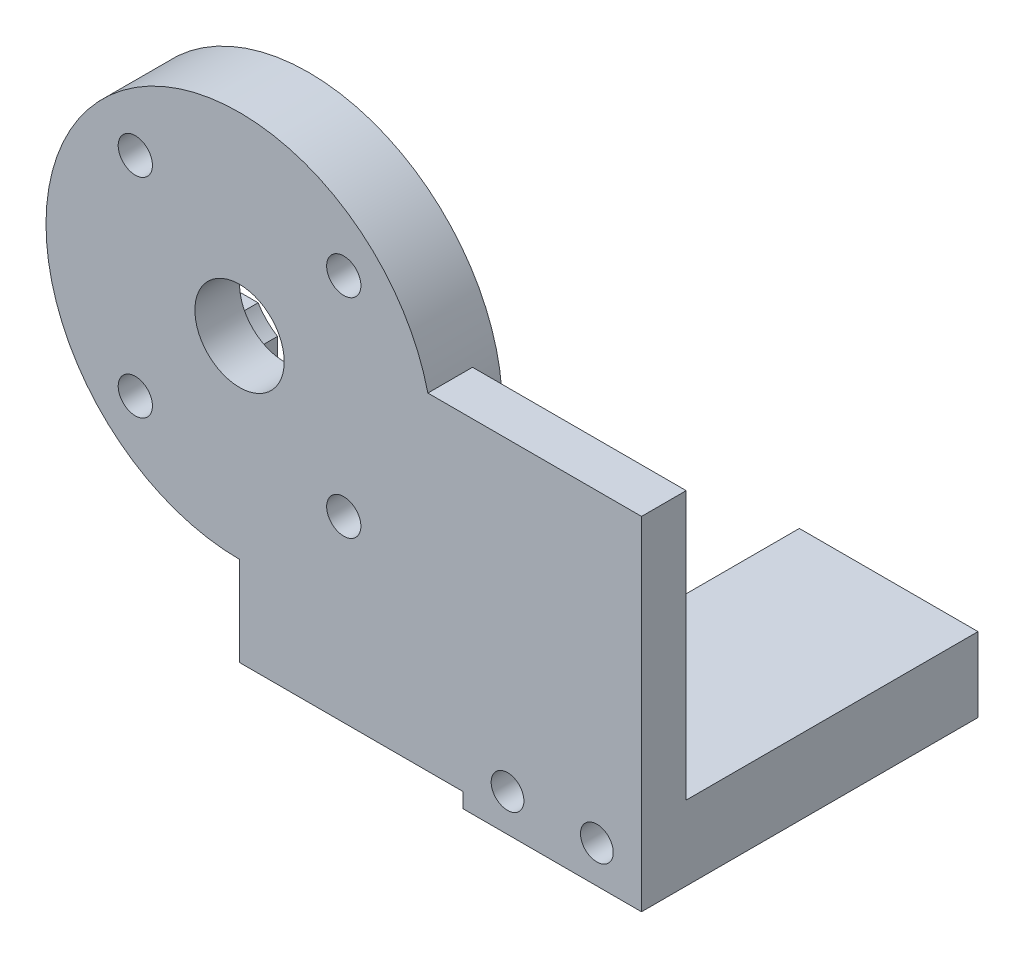
ISO-10303-21;
HEADER;
FILE_DESCRIPTION(('STEP AP214'),'2;1');
FILE_NAME('part.step','',(''),(''),'','','');
FILE_SCHEMA(('AUTOMOTIVE_DESIGN { 1 0 10303 214 1 1 1 1 }'));
ENDSEC;
DATA;
#1=APPLICATION_CONTEXT('core data for automotive mechanical design processes');
#2=APPLICATION_PROTOCOL_DEFINITION('international standard','automotive_design',2000,#1);
#3=PRODUCT_CONTEXT('',#1,'mechanical');
#4=PRODUCT('Part','Part','',(#3));
#5=PRODUCT_RELATED_PRODUCT_CATEGORY('part','',(#4));
#6=PRODUCT_DEFINITION_FORMATION('','',#4);
#7=PRODUCT_DEFINITION_CONTEXT('part definition',#1,'design');
#8=PRODUCT_DEFINITION('design','',#6,#7);
#9=PRODUCT_DEFINITION_SHAPE('','',#8);
#10=(LENGTH_UNIT() NAMED_UNIT(*) SI_UNIT(.MILLI.,.METRE.));
#11=(NAMED_UNIT(*) PLANE_ANGLE_UNIT() SI_UNIT($,.RADIAN.));
#12=(NAMED_UNIT(*) SI_UNIT($,.STERADIAN.) SOLID_ANGLE_UNIT());
#13=UNCERTAINTY_MEASURE_WITH_UNIT(LENGTH_MEASURE(1.E-05),#10,'distance_accuracy_value','');
#14=(GEOMETRIC_REPRESENTATION_CONTEXT(3) GLOBAL_UNCERTAINTY_ASSIGNED_CONTEXT((#13)) GLOBAL_UNIT_ASSIGNED_CONTEXT((#10,
#11,#12)) REPRESENTATION_CONTEXT('',''));
#15=CARTESIAN_POINT('',(0.,0.,0.));
#16=DIRECTION('',(0.,0.,1.));
#17=DIRECTION('',(1.,0.,0.));
#18=AXIS2_PLACEMENT_3D('',#15,#16,#17);
#19=CARTESIAN_POINT('',(0.,0.,17.95));
#20=DIRECTION('',(0.,0.,1.));
#21=DIRECTION('',(1.,0.,0.));
#22=AXIS2_PLACEMENT_3D('',#19,#20,#21);
#23=PLANE('',#22);
#24=CARTESIAN_POINT('',(7.,-7.,17.95));
#25=DIRECTION('',(0.,0.,1.));
#26=DIRECTION('',(1.,0.,0.));
#27=AXIS2_PLACEMENT_3D('',#24,#25,#26);
#28=CIRCLE('',#27,1.15);
#29=CARTESIAN_POINT('',(8.15,-7.,17.95));
#30=VERTEX_POINT('',#29);
#31=EDGE_CURVE('E445',#30,#30,#28,.F.);
#32=ORIENTED_EDGE('',*,*,#31,.F.);
#33=EDGE_LOOP('',(#32));
#34=FACE_BOUND('',#33,.T.);
#35=CARTESIAN_POINT('',(-7.,-7.,17.95));
#36=DIRECTION('',(0.,0.,1.));
#37=DIRECTION('',(1.,0.,0.));
#38=AXIS2_PLACEMENT_3D('',#35,#36,#37);
#39=CIRCLE('',#38,1.15);
#40=CARTESIAN_POINT('',(-5.85,-7.,17.95));
#41=VERTEX_POINT('',#40);
#42=EDGE_CURVE('E437',#41,#41,#39,.F.);
#43=ORIENTED_EDGE('',*,*,#42,.F.);
#44=EDGE_LOOP('',(#43));
#45=FACE_BOUND('',#44,.T.);
#46=CARTESIAN_POINT('',(-7.,7.,17.95));
#47=DIRECTION('',(0.,0.,1.));
#48=DIRECTION('',(1.,0.,0.));
#49=AXIS2_PLACEMENT_3D('',#46,#47,#48);
#50=CIRCLE('',#49,1.15);
#51=CARTESIAN_POINT('',(-5.85,7.,17.95));
#52=VERTEX_POINT('',#51);
#53=EDGE_CURVE('E432',#52,#52,#50,.F.);
#54=ORIENTED_EDGE('',*,*,#53,.F.);
#55=EDGE_LOOP('',(#54));
#56=FACE_BOUND('',#55,.T.);
#57=CARTESIAN_POINT('',(7.,7.,17.95));
#58=DIRECTION('',(0.,0.,1.));
#59=DIRECTION('',(1.,0.,0.));
#60=AXIS2_PLACEMENT_3D('',#57,#58,#59);
#61=CIRCLE('',#60,1.15);
#62=CARTESIAN_POINT('',(8.15,7.,17.95));
#63=VERTEX_POINT('',#62);
#64=EDGE_CURVE('E429',#63,#63,#61,.F.);
#65=ORIENTED_EDGE('',*,*,#64,.F.);
#66=EDGE_LOOP('',(#65));
#67=FACE_BOUND('',#66,.T.);
#68=CARTESIAN_POINT('',(0.,0.,17.95));
#69=DIRECTION('',(0.,0.,1.));
#70=DIRECTION('',(1.,0.,0.));
#71=AXIS2_PLACEMENT_3D('',#68,#69,#70);
#72=CIRCLE('',#71,13.);
#73=CARTESIAN_POINT('',(13.,0.,17.95));
#74=VERTEX_POINT('',#73);
#75=EDGE_CURVE('E271',#74,#74,#72,.T.);
#76=ORIENTED_EDGE('',*,*,#75,.F.);
#77=EDGE_LOOP('',(#76));
#78=FACE_BOUND('',#77,.T.);
#79=DIRECTION('',(-1.,0.,0.));
#80=VECTOR('',#79,1.);
#81=CARTESIAN_POINT('',(-8.15,2.1,17.95));
#82=LINE('',#81,#80);
#83=CARTESIAN_POINT('',(8.15,2.1,17.95));
#84=VERTEX_POINT('',#83);
#85=CARTESIAN_POINT('',(3.40440890610984,2.1,17.95));
#86=VERTEX_POINT('',#85);
#87=EDGE_CURVE('E226',#84,#86,#82,.T.);
#88=ORIENTED_EDGE('',*,*,#87,.T.);
#89=CARTESIAN_POINT('',(0.,0.,17.95));
#90=DIRECTION('',(0.,0.,1.));
#91=DIRECTION('',(1.,0.,0.));
#92=AXIS2_PLACEMENT_3D('',#89,#90,#91);
#93=CIRCLE('',#92,4.);
#94=CARTESIAN_POINT('',(2.1,3.40440890610984,17.95));
#95=VERTEX_POINT('',#94);
#96=EDGE_CURVE('E213',#86,#95,#93,.T.);
#97=ORIENTED_EDGE('',*,*,#96,.T.);
#98=DIRECTION('',(0.,1.,0.));
#99=VECTOR('',#98,1.);
#100=CARTESIAN_POINT('',(2.1,-8.15,17.95));
#101=LINE('',#100,#99);
#102=CARTESIAN_POINT('',(2.1,8.15,17.95));
#103=VERTEX_POINT('',#102);
#104=EDGE_CURVE('E488',#95,#103,#101,.T.);
#105=ORIENTED_EDGE('',*,*,#104,.T.);
#106=CARTESIAN_POINT('',(0.,8.15,17.95));
#107=DIRECTION('',(0.,0.,1.));
#108=DIRECTION('',(1.,0.,0.));
#109=AXIS2_PLACEMENT_3D('',#106,#107,#108);
#110=CIRCLE('',#109,2.1);
#111=CARTESIAN_POINT('',(-2.1,8.15,17.95));
#112=VERTEX_POINT('',#111);
#113=EDGE_CURVE('E458',#103,#112,#110,.T.);
#114=ORIENTED_EDGE('',*,*,#113,.T.);
#115=DIRECTION('',(0.,-1.,0.));
#116=VECTOR('',#115,1.);
#117=CARTESIAN_POINT('',(-2.1,-8.15,17.95));
#118=LINE('',#117,#116);
#119=CARTESIAN_POINT('',(-2.1,3.40440890610984,17.95));
#120=VERTEX_POINT('',#119);
#121=EDGE_CURVE('E482',#112,#120,#118,.T.);
#122=ORIENTED_EDGE('',*,*,#121,.T.);
#123=CARTESIAN_POINT('',(-3.40440890610984,2.1,17.95));
#124=VERTEX_POINT('',#123);
#125=EDGE_CURVE('E72',#120,#124,#93,.T.);
#126=ORIENTED_EDGE('',*,*,#125,.T.);
#127=CARTESIAN_POINT('',(-8.15,2.1,17.95));
#128=VERTEX_POINT('',#127);
#129=EDGE_CURVE('E244',#124,#128,#82,.T.);
#130=ORIENTED_EDGE('',*,*,#129,.T.);
#131=CARTESIAN_POINT('',(-8.15,0.,17.95));
#132=DIRECTION('',(0.,0.,1.));
#133=DIRECTION('',(1.,0.,0.));
#134=AXIS2_PLACEMENT_3D('',#131,#132,#133);
#135=CIRCLE('',#134,2.1);
#136=CARTESIAN_POINT('',(-8.15,-2.1,17.95));
#137=VERTEX_POINT('',#136);
#138=EDGE_CURVE('E454',#128,#137,#135,.T.);
#139=ORIENTED_EDGE('',*,*,#138,.T.);
#140=DIRECTION('',(1.,0.,0.));
#141=VECTOR('',#140,1.);
#142=CARTESIAN_POINT('',(-8.15,-2.1,17.95));
#143=LINE('',#142,#141);
#144=CARTESIAN_POINT('',(-3.40440890610984,-2.1,17.95));
#145=VERTEX_POINT('',#144);
#146=EDGE_CURVE('E249',#137,#145,#143,.T.);
#147=ORIENTED_EDGE('',*,*,#146,.T.);
#148=CARTESIAN_POINT('',(-2.1,-3.40440890610984,17.95));
#149=VERTEX_POINT('',#148);
#150=EDGE_CURVE('E536',#145,#149,#93,.T.);
#151=ORIENTED_EDGE('',*,*,#150,.T.);
#152=CARTESIAN_POINT('',(-2.1,-8.15,17.95));
#153=VERTEX_POINT('',#152);
#154=EDGE_CURVE('E446',#149,#153,#118,.T.);
#155=ORIENTED_EDGE('',*,*,#154,.T.);
#156=CARTESIAN_POINT('',(0.,-8.15,17.95));
#157=DIRECTION('',(0.,0.,1.));
#158=DIRECTION('',(1.,0.,0.));
#159=AXIS2_PLACEMENT_3D('',#156,#157,#158);
#160=CIRCLE('',#159,2.1);
#161=CARTESIAN_POINT('',(2.1,-8.15,17.95));
#162=VERTEX_POINT('',#161);
#163=EDGE_CURVE('E470',#153,#162,#160,.T.);
#164=ORIENTED_EDGE('',*,*,#163,.T.);
#165=CARTESIAN_POINT('',(2.1,-3.40440890610984,17.95));
#166=VERTEX_POINT('',#165);
#167=EDGE_CURVE('E487',#162,#166,#101,.T.);
#168=ORIENTED_EDGE('',*,*,#167,.T.);
#169=CARTESIAN_POINT('',(3.40440890610984,-2.1,17.95));
#170=VERTEX_POINT('',#169);
#171=EDGE_CURVE('E221',#166,#170,#93,.T.);
#172=ORIENTED_EDGE('',*,*,#171,.T.);
#173=CARTESIAN_POINT('',(8.15,-2.1,17.95));
#174=VERTEX_POINT('',#173);
#175=EDGE_CURVE('E501',#170,#174,#143,.T.);
#176=ORIENTED_EDGE('',*,*,#175,.T.);
#177=CARTESIAN_POINT('',(8.15,0.,17.95));
#178=DIRECTION('',(0.,0.,1.));
#179=DIRECTION('',(1.,0.,0.));
#180=AXIS2_PLACEMENT_3D('',#177,#178,#179);
#181=CIRCLE('',#180,2.1);
#182=EDGE_CURVE('E239',#174,#84,#181,.T.);
#183=ORIENTED_EDGE('',*,*,#182,.T.);
#184=EDGE_LOOP('',(#88,#97,#105,#114,#122,#126,#130,#139,#147,#151,#155,#164,#168,#172,#176,#183));
#185=FACE_BOUND('',#184,.T.);
#186=ADVANCED_FACE('F44',(#34,#45,#56,#67,#78,#185),#23,.F.);
#187=CARTESIAN_POINT('',(-8.15,-2.1,19.6));
#188=DIRECTION('',(0.,1.,0.));
#189=DIRECTION('',(0.,0.,1.));
#190=AXIS2_PLACEMENT_3D('',#187,#188,#189);
#191=PLANE('',#190);
#192=ORIENTED_EDGE('',*,*,#175,.F.);
#193=DIRECTION('',(0.,0.,-1.));
#194=VECTOR('',#193,1.);
#195=CARTESIAN_POINT('',(3.40440890610984,-2.1,19.6));
#196=LINE('',#195,#194);
#197=CARTESIAN_POINT('',(3.40440890610984,-2.1,19.6));
#198=VERTEX_POINT('',#197);
#199=EDGE_CURVE('E231',#170,#198,#196,.F.);
#200=ORIENTED_EDGE('',*,*,#199,.T.);
#201=DIRECTION('',(1.,0.,0.));
#202=VECTOR('',#201,1.);
#203=CARTESIAN_POINT('',(-8.15,-2.1,19.6));
#204=LINE('',#203,#202);
#205=CARTESIAN_POINT('',(8.15,-2.1,19.6));
#206=VERTEX_POINT('',#205);
#207=EDGE_CURVE('E243',#198,#206,#204,.T.);
#208=ORIENTED_EDGE('',*,*,#207,.T.);
#209=DIRECTION('',(0.,0.,-1.));
#210=VECTOR('',#209,1.);
#211=CARTESIAN_POINT('',(8.15,-2.1,19.6));
#212=LINE('',#211,#210);
#213=EDGE_CURVE('E259',#206,#174,#212,.T.);
#214=ORIENTED_EDGE('',*,*,#213,.T.);
#215=EDGE_LOOP('',(#192,#200,#208,#214));
#216=FACE_BOUND('',#215,.T.);
#217=ADVANCED_FACE('F544',(#216),#191,.T.);
#218=CARTESIAN_POINT('',(-8.15,2.1,19.6));
#219=DIRECTION('',(0.,-1.,0.));
#220=DIRECTION('',(0.,0.,-1.));
#221=AXIS2_PLACEMENT_3D('',#218,#219,#220);
#222=PLANE('',#221);
#223=DIRECTION('',(-1.,0.,0.));
#224=VECTOR('',#223,1.);
#225=CARTESIAN_POINT('',(-8.15,2.1,19.6));
#226=LINE('',#225,#224);
#227=CARTESIAN_POINT('',(8.15,2.1,19.6));
#228=VERTEX_POINT('',#227);
#229=CARTESIAN_POINT('',(3.40440890610984,2.1,19.6));
#230=VERTEX_POINT('',#229);
#231=EDGE_CURVE('E235',#228,#230,#226,.T.);
#232=ORIENTED_EDGE('',*,*,#231,.T.);
#233=DIRECTION('',(0.,0.,-1.));
#234=VECTOR('',#233,1.);
#235=CARTESIAN_POINT('',(3.40440890610984,2.1,19.6));
#236=LINE('',#235,#234);
#237=EDGE_CURVE('E216',#230,#86,#236,.T.);
#238=ORIENTED_EDGE('',*,*,#237,.T.);
#239=ORIENTED_EDGE('',*,*,#87,.F.);
#240=DIRECTION('',(0.,0.,-1.));
#241=VECTOR('',#240,1.);
#242=CARTESIAN_POINT('',(8.15,2.1,19.6));
#243=LINE('',#242,#241);
#244=EDGE_CURVE('E258',#228,#84,#243,.T.);
#245=ORIENTED_EDGE('',*,*,#244,.F.);
#246=EDGE_LOOP('',(#232,#238,#239,#245));
#247=FACE_BOUND('',#246,.T.);
#248=ADVANCED_FACE('F227',(#247),#222,.T.);
#249=ORIENTED_EDGE('',*,*,#129,.F.);
#250=DIRECTION('',(0.,0.,-1.));
#251=VECTOR('',#250,1.);
#252=CARTESIAN_POINT('',(-3.40440890610984,2.1,19.6));
#253=LINE('',#252,#251);
#254=CARTESIAN_POINT('',(-3.40440890610984,2.1,19.6));
#255=VERTEX_POINT('',#254);
#256=EDGE_CURVE('E233',#124,#255,#253,.F.);
#257=ORIENTED_EDGE('',*,*,#256,.T.);
#258=CARTESIAN_POINT('',(-8.15,2.1,19.6));
#259=VERTEX_POINT('',#258);
#260=EDGE_CURVE('E509',#255,#259,#226,.T.);
#261=ORIENTED_EDGE('',*,*,#260,.T.);
#262=DIRECTION('',(0.,0.,-1.));
#263=VECTOR('',#262,1.);
#264=CARTESIAN_POINT('',(-8.15,2.1,19.6));
#265=LINE('',#264,#263);
#266=EDGE_CURVE('E252',#259,#128,#265,.T.);
#267=ORIENTED_EDGE('',*,*,#266,.T.);
#268=EDGE_LOOP('',(#249,#257,#261,#267));
#269=FACE_BOUND('',#268,.T.);
#270=ADVANCED_FACE('F513',(#269),#222,.T.);
#271=CARTESIAN_POINT('',(-8.15,-2.1,19.6));
#272=VERTEX_POINT('',#271);
#273=CARTESIAN_POINT('',(-3.40440890610984,-2.1,19.6));
#274=VERTEX_POINT('',#273);
#275=EDGE_CURVE('E247',#272,#274,#204,.T.);
#276=ORIENTED_EDGE('',*,*,#275,.T.);
#277=DIRECTION('',(0.,0.,-1.));
#278=VECTOR('',#277,1.);
#279=CARTESIAN_POINT('',(-3.40440890610984,-2.1,19.6));
#280=LINE('',#279,#278);
#281=EDGE_CURVE('E404',#274,#145,#280,.T.);
#282=ORIENTED_EDGE('',*,*,#281,.T.);
#283=ORIENTED_EDGE('',*,*,#146,.F.);
#284=DIRECTION('',(0.,0.,-1.));
#285=VECTOR('',#284,1.);
#286=CARTESIAN_POINT('',(-8.15,-2.1,19.6));
#287=LINE('',#286,#285);
#288=EDGE_CURVE('E263',#272,#137,#287,.T.);
#289=ORIENTED_EDGE('',*,*,#288,.F.);
#290=EDGE_LOOP('',(#276,#282,#283,#289));
#291=FACE_BOUND('',#290,.T.);
#292=ADVANCED_FACE('F533',(#291),#191,.T.);
#293=CARTESIAN_POINT('',(2.1,-8.15,19.6));
#294=DIRECTION('',(-1.,0.,0.));
#295=DIRECTION('',(0.,0.,1.));
#296=AXIS2_PLACEMENT_3D('',#293,#294,#295);
#297=PLANE('',#296);
#298=ORIENTED_EDGE('',*,*,#104,.F.);
#299=DIRECTION('',(0.,0.,-1.));
#300=VECTOR('',#299,1.);
#301=CARTESIAN_POINT('',(2.1,3.40440890610984,19.6));
#302=LINE('',#301,#300);
#303=CARTESIAN_POINT('',(2.1,3.40440890610984,19.6));
#304=VERTEX_POINT('',#303);
#305=EDGE_CURVE('E220',#95,#304,#302,.F.);
#306=ORIENTED_EDGE('',*,*,#305,.T.);
#307=DIRECTION('',(0.,1.,0.));
#308=VECTOR('',#307,1.);
#309=CARTESIAN_POINT('',(2.1,-8.15,19.6));
#310=LINE('',#309,#308);
#311=CARTESIAN_POINT('',(2.1,8.15,19.6));
#312=VERTEX_POINT('',#311);
#313=EDGE_CURVE('E480',#304,#312,#310,.T.);
#314=ORIENTED_EDGE('',*,*,#313,.T.);
#315=DIRECTION('',(0.,0.,-1.));
#316=VECTOR('',#315,1.);
#317=CARTESIAN_POINT('',(2.1,8.15,19.6));
#318=LINE('',#317,#316);
#319=EDGE_CURVE('E494',#312,#103,#318,.T.);
#320=ORIENTED_EDGE('',*,*,#319,.T.);
#321=EDGE_LOOP('',(#298,#306,#314,#320));
#322=FACE_BOUND('',#321,.T.);
#323=ADVANCED_FACE('F644',(#322),#297,.T.);
#324=CARTESIAN_POINT('',(-2.1,-8.15,19.6));
#325=DIRECTION('',(1.,0.,0.));
#326=DIRECTION('',(0.,0.,-1.));
#327=AXIS2_PLACEMENT_3D('',#324,#325,#326);
#328=PLANE('',#327);
#329=DIRECTION('',(0.,-1.,0.));
#330=VECTOR('',#329,1.);
#331=CARTESIAN_POINT('',(-2.1,-8.15,19.6));
#332=LINE('',#331,#330);
#333=CARTESIAN_POINT('',(-2.1,8.15,19.6));
#334=VERTEX_POINT('',#333);
#335=CARTESIAN_POINT('',(-2.1,3.40440890610984,19.6));
#336=VERTEX_POINT('',#335);
#337=EDGE_CURVE('E471',#334,#336,#332,.T.);
#338=ORIENTED_EDGE('',*,*,#337,.T.);
#339=DIRECTION('',(0.,0.,-1.));
#340=VECTOR('',#339,1.);
#341=CARTESIAN_POINT('',(-2.1,3.40440890610984,19.6));
#342=LINE('',#341,#340);
#343=EDGE_CURVE('E396',#336,#120,#342,.T.);
#344=ORIENTED_EDGE('',*,*,#343,.T.);
#345=ORIENTED_EDGE('',*,*,#121,.F.);
#346=DIRECTION('',(0.,0.,-1.));
#347=VECTOR('',#346,1.);
#348=CARTESIAN_POINT('',(-2.1,8.15,19.6));
#349=LINE('',#348,#347);
#350=EDGE_CURVE('E483',#334,#112,#349,.T.);
#351=ORIENTED_EDGE('',*,*,#350,.F.);
#352=EDGE_LOOP('',(#338,#344,#345,#351));
#353=FACE_BOUND('',#352,.T.);
#354=ADVANCED_FACE('F775',(#353),#328,.T.);
#355=ORIENTED_EDGE('',*,*,#154,.F.);
#356=DIRECTION('',(0.,0.,-1.));
#357=VECTOR('',#356,1.);
#358=CARTESIAN_POINT('',(-2.1,-3.40440890610984,19.6));
#359=LINE('',#358,#357);
#360=CARTESIAN_POINT('',(-2.1,-3.40440890610984,19.6));
#361=VERTEX_POINT('',#360);
#362=EDGE_CURVE('E392',#149,#361,#359,.F.);
#363=ORIENTED_EDGE('',*,*,#362,.T.);
#364=CARTESIAN_POINT('',(-2.1,-8.15,19.6));
#365=VERTEX_POINT('',#364);
#366=EDGE_CURVE('E476',#361,#365,#332,.T.);
#367=ORIENTED_EDGE('',*,*,#366,.T.);
#368=DIRECTION('',(0.,0.,-1.));
#369=VECTOR('',#368,1.);
#370=CARTESIAN_POINT('',(-2.1,-8.15,19.6));
#371=LINE('',#370,#369);
#372=EDGE_CURVE('E504',#365,#153,#371,.T.);
#373=ORIENTED_EDGE('',*,*,#372,.T.);
#374=EDGE_LOOP('',(#355,#363,#367,#373));
#375=FACE_BOUND('',#374,.T.);
#376=ADVANCED_FACE('F568',(#375),#328,.T.);
#377=CARTESIAN_POINT('',(2.1,-8.15,19.6));
#378=VERTEX_POINT('',#377);
#379=CARTESIAN_POINT('',(2.1,-3.40440890610984,19.6));
#380=VERTEX_POINT('',#379);
#381=EDGE_CURVE('E479',#378,#380,#310,.T.);
#382=ORIENTED_EDGE('',*,*,#381,.T.);
#383=DIRECTION('',(0.,0.,-1.));
#384=VECTOR('',#383,1.);
#385=CARTESIAN_POINT('',(2.1,-3.40440890610984,19.6));
#386=LINE('',#385,#384);
#387=EDGE_CURVE('E11',#380,#166,#386,.T.);
#388=ORIENTED_EDGE('',*,*,#387,.T.);
#389=ORIENTED_EDGE('',*,*,#167,.F.);
#390=DIRECTION('',(0.,0.,-1.));
#391=VECTOR('',#390,1.);
#392=CARTESIAN_POINT('',(2.1,-8.15,19.6));
#393=LINE('',#392,#391);
#394=EDGE_CURVE('E496',#378,#162,#393,.T.);
#395=ORIENTED_EDGE('',*,*,#394,.F.);
#396=EDGE_LOOP('',(#382,#388,#389,#395));
#397=FACE_BOUND('',#396,.T.);
#398=ADVANCED_FACE('F561',(#397),#297,.T.);
#399=CARTESIAN_POINT('',(0.,0.,19.6));
#400=DIRECTION('',(0.,0.,1.));
#401=DIRECTION('',(1.,0.,0.));
#402=AXIS2_PLACEMENT_3D('',#399,#400,#401);
#403=PLANE('',#402);
#404=DIRECTION('',(0.,-1.,0.));
#405=VECTOR('',#404,1.);
#406=CARTESIAN_POINT('',(0.,-19.,19.6));
#407=LINE('',#406,#405);
#408=CARTESIAN_POINT('',(0.,-13.,19.6));
#409=VERTEX_POINT('',#408);
#410=CARTESIAN_POINT('',(0.,-19.,19.6));
#411=VERTEX_POINT('',#410);
#412=EDGE_CURVE('E321',#409,#411,#407,.T.);
#413=ORIENTED_EDGE('',*,*,#412,.F.);
#414=CARTESIAN_POINT('',(0.,0.,19.6));
#415=DIRECTION('',(0.,0.,1.));
#416=DIRECTION('',(1.,0.,0.));
#417=AXIS2_PLACEMENT_3D('',#414,#415,#416);
#418=CIRCLE('',#417,13.);
#419=CARTESIAN_POINT('',(12.6491106406735,3.,19.6));
#420=VERTEX_POINT('',#419);
#421=EDGE_CURVE('E270',#409,#420,#418,.T.);
#422=ORIENTED_EDGE('',*,*,#421,.T.);
#423=DIRECTION('',(-1.,0.,0.));
#424=VECTOR('',#423,1.);
#425=CARTESIAN_POINT('',(0.,3.,19.6));
#426=LINE('',#425,#424);
#427=CARTESIAN_POINT('',(27.,3.,19.6));
#428=VERTEX_POINT('',#427);
#429=EDGE_CURVE('E326',#428,#420,#426,.T.);
#430=ORIENTED_EDGE('',*,*,#429,.F.);
#431=DIRECTION('',(0.,1.,0.));
#432=VECTOR('',#431,1.);
#433=CARTESIAN_POINT('',(27.,-19.,19.6));
#434=LINE('',#433,#432);
#435=CARTESIAN_POINT('',(27.,-15.,19.6));
#436=VERTEX_POINT('',#435);
#437=EDGE_CURVE('E344',#436,#428,#434,.T.);
#438=ORIENTED_EDGE('',*,*,#437,.F.);
#439=DIRECTION('',(1.,0.,0.));
#440=VECTOR('',#439,1.);
#441=CARTESIAN_POINT('',(0.,-15.,19.6));
#442=LINE('',#441,#440);
#443=CARTESIAN_POINT('',(15.,-15.,19.6));
#444=VERTEX_POINT('',#443);
#445=EDGE_CURVE('E54',#444,#436,#442,.T.);
#446=ORIENTED_EDGE('',*,*,#445,.F.);
#447=DIRECTION('',(0.,1.,0.));
#448=VECTOR('',#447,1.);
#449=CARTESIAN_POINT('',(15.,0.,19.6));
#450=LINE('',#449,#448);
#451=CARTESIAN_POINT('',(15.,-19.,19.6));
#452=VERTEX_POINT('',#451);
#453=EDGE_CURVE('E320',#452,#444,#450,.T.);
#454=ORIENTED_EDGE('',*,*,#453,.F.);
#455=DIRECTION('',(1.,0.,0.));
#456=VECTOR('',#455,1.);
#457=CARTESIAN_POINT('',(0.,-19.,19.6));
#458=LINE('',#457,#456);
#459=EDGE_CURVE('E336',#411,#452,#458,.T.);
#460=ORIENTED_EDGE('',*,*,#459,.F.);
#461=EDGE_LOOP('',(#413,#422,#430,#438,#446,#454,#460));
#462=FACE_BOUND('',#461,.T.);
#463=ADVANCED_FACE('F630',(#462),#403,.F.);
#464=CARTESIAN_POINT('',(0.,-19.,22.6));
#465=DIRECTION('',(0.,1.,0.));
#466=DIRECTION('',(0.,0.,1.));
#467=AXIS2_PLACEMENT_3D('',#464,#465,#466);
#468=PLANE('',#467);
#469=DIRECTION('',(0.,0.,-1.));
#470=VECTOR('',#469,1.);
#471=CARTESIAN_POINT('',(15.,-19.,22.6));
#472=LINE('',#471,#470);
#473=CARTESIAN_POINT('',(15.,-19.,22.6));
#474=VERTEX_POINT('',#473);
#475=EDGE_CURVE('E366',#474,#452,#472,.T.);
#476=ORIENTED_EDGE('',*,*,#475,.F.);
#477=DIRECTION('',(1.,0.,0.));
#478=VECTOR('',#477,1.);
#479=CARTESIAN_POINT('',(0.,-19.,22.6));
#480=LINE('',#479,#478);
#481=CARTESIAN_POINT('',(0.,-19.,22.6));
#482=VERTEX_POINT('',#481);
#483=EDGE_CURVE('E324',#482,#474,#480,.T.);
#484=ORIENTED_EDGE('',*,*,#483,.F.);
#485=DIRECTION('',(0.,0.,-1.));
#486=VECTOR('',#485,1.);
#487=CARTESIAN_POINT('',(0.,-19.,22.6));
#488=LINE('',#487,#486);
#489=EDGE_CURVE('E354',#482,#411,#488,.T.);
#490=ORIENTED_EDGE('',*,*,#489,.T.);
#491=ORIENTED_EDGE('',*,*,#459,.T.);
#492=EDGE_LOOP('',(#476,#484,#490,#491));
#493=FACE_BOUND('',#492,.T.);
#494=ADVANCED_FACE('F628',(#493),#468,.F.);
#495=CARTESIAN_POINT('',(0.,0.,22.6));
#496=DIRECTION('',(0.,0.,-1.));
#497=DIRECTION('',(-1.,0.,0.));
#498=AXIS2_PLACEMENT_3D('',#495,#496,#497);
#499=CYLINDRICAL_SURFACE('',#498,13.);
#500=DIRECTION('',(0.,0.,-1.));
#501=VECTOR('',#500,1.);
#502=CARTESIAN_POINT('',(0.,-13.,22.6));
#503=LINE('',#502,#501);
#504=CARTESIAN_POINT('',(0.,-13.,22.6));
#505=VERTEX_POINT('',#504);
#506=EDGE_CURVE('E365',#505,#409,#503,.T.);
#507=ORIENTED_EDGE('',*,*,#506,.F.);
#508=CARTESIAN_POINT('',(0.,0.,22.6));
#509=DIRECTION('',(0.,0.,1.));
#510=DIRECTION('',(1.,0.,0.));
#511=AXIS2_PLACEMENT_3D('',#508,#509,#510);
#512=CIRCLE('',#511,13.);
#513=CARTESIAN_POINT('',(12.6491106406735,3.,22.6));
#514=VERTEX_POINT('',#513);
#515=EDGE_CURVE('E358',#514,#505,#512,.T.);
#516=ORIENTED_EDGE('',*,*,#515,.F.);
#517=DIRECTION('',(0.,0.,-1.));
#518=VECTOR('',#517,1.);
#519=CARTESIAN_POINT('',(12.6491106406735,3.,22.6));
#520=LINE('',#519,#518);
#521=EDGE_CURVE('E357',#420,#514,#520,.F.);
#522=ORIENTED_EDGE('',*,*,#521,.F.);
#523=ORIENTED_EDGE('',*,*,#421,.F.);
#524=EDGE_LOOP('',(#507,#516,#522,#523));
#525=FACE_BOUND('',#524,.T.);
#526=ORIENTED_EDGE('',*,*,#75,.T.);
#527=EDGE_LOOP('',(#526));
#528=FACE_BOUND('',#527,.T.);
#529=ADVANCED_FACE('F50',(#525,#528),#499,.T.);
#530=CARTESIAN_POINT('',(0.,0.,22.6));
#531=DIRECTION('',(0.,0.,1.));
#532=DIRECTION('',(1.,0.,0.));
#533=AXIS2_PLACEMENT_3D('',#530,#531,#532);
#534=PLANE('',#533);
#535=CARTESIAN_POINT('',(18.,-17.5,22.6));
#536=DIRECTION('',(0.,0.,1.));
#537=DIRECTION('',(1.,0.,0.));
#538=AXIS2_PLACEMENT_3D('',#535,#536,#537);
#539=CIRCLE('',#538,1.1);
#540=CARTESIAN_POINT('',(19.1,-17.5,22.6));
#541=VERTEX_POINT('',#540);
#542=EDGE_CURVE('E380',#541,#541,#539,.T.);
#543=ORIENTED_EDGE('',*,*,#542,.F.);
#544=EDGE_LOOP('',(#543));
#545=FACE_BOUND('',#544,.T.);
#546=CARTESIAN_POINT('',(24.,-17.5,22.6));
#547=DIRECTION('',(0.,0.,1.));
#548=DIRECTION('',(1.,0.,0.));
#549=AXIS2_PLACEMENT_3D('',#546,#547,#548);
#550=CIRCLE('',#549,1.1);
#551=CARTESIAN_POINT('',(25.1,-17.5,22.6));
#552=VERTEX_POINT('',#551);
#553=EDGE_CURVE('E383',#552,#552,#550,.T.);
#554=ORIENTED_EDGE('',*,*,#553,.F.);
#555=EDGE_LOOP('',(#554));
#556=FACE_BOUND('',#555,.T.);
#557=CARTESIAN_POINT('',(7.,-7.,22.6));
#558=DIRECTION('',(0.,0.,1.));
#559=DIRECTION('',(1.,0.,0.));
#560=AXIS2_PLACEMENT_3D('',#557,#558,#559);
#561=CIRCLE('',#560,1.15);
#562=CARTESIAN_POINT('',(8.15,-7.,22.6));
#563=VERTEX_POINT('',#562);
#564=EDGE_CURVE('E411',#563,#563,#561,.T.);
#565=ORIENTED_EDGE('',*,*,#564,.F.);
#566=EDGE_LOOP('',(#565));
#567=FACE_BOUND('',#566,.T.);
#568=CARTESIAN_POINT('',(-7.,-7.,22.6));
#569=DIRECTION('',(0.,0.,1.));
#570=DIRECTION('',(1.,0.,0.));
#571=AXIS2_PLACEMENT_3D('',#568,#569,#570);
#572=CIRCLE('',#571,1.15);
#573=CARTESIAN_POINT('',(-5.85,-7.,22.6));
#574=VERTEX_POINT('',#573);
#575=EDGE_CURVE('E419',#574,#574,#572,.T.);
#576=ORIENTED_EDGE('',*,*,#575,.F.);
#577=EDGE_LOOP('',(#576));
#578=FACE_BOUND('',#577,.T.);
#579=CARTESIAN_POINT('',(-7.,7.,22.6));
#580=DIRECTION('',(0.,0.,1.));
#581=DIRECTION('',(1.,0.,0.));
#582=AXIS2_PLACEMENT_3D('',#579,#580,#581);
#583=CIRCLE('',#582,1.15);
#584=CARTESIAN_POINT('',(-5.85,7.,22.6));
#585=VERTEX_POINT('',#584);
#586=EDGE_CURVE('E413',#585,#585,#583,.T.);
#587=ORIENTED_EDGE('',*,*,#586,.F.);
#588=EDGE_LOOP('',(#587));
#589=FACE_BOUND('',#588,.T.);
#590=CARTESIAN_POINT('',(7.,7.,22.6));
#591=DIRECTION('',(0.,0.,1.));
#592=DIRECTION('',(1.,0.,0.));
#593=AXIS2_PLACEMENT_3D('',#590,#591,#592);
#594=CIRCLE('',#593,1.15);
#595=CARTESIAN_POINT('',(8.15,7.,22.6));
#596=VERTEX_POINT('',#595);
#597=EDGE_CURVE('E420',#596,#596,#594,.T.);
#598=ORIENTED_EDGE('',*,*,#597,.F.);
#599=EDGE_LOOP('',(#598));
#600=FACE_BOUND('',#599,.T.);
#601=CARTESIAN_POINT('',(0.,0.,22.6));
#602=DIRECTION('',(0.,0.,1.));
#603=DIRECTION('',(1.,0.,0.));
#604=AXIS2_PLACEMENT_3D('',#601,#602,#603);
#605=CIRCLE('',#604,3.);
#606=CARTESIAN_POINT('',(3.,0.,22.6));
#607=VERTEX_POINT('',#606);
#608=EDGE_CURVE('E269',#607,#607,#605,.T.);
#609=ORIENTED_EDGE('',*,*,#608,.F.);
#610=EDGE_LOOP('',(#609));
#611=FACE_BOUND('',#610,.T.);
#612=ORIENTED_EDGE('',*,*,#483,.T.);
#613=DIRECTION('',(0.,-1.,0.));
#614=VECTOR('',#613,1.);
#615=CARTESIAN_POINT('',(15.,-20.,22.6));
#616=LINE('',#615,#614);
#617=CARTESIAN_POINT('',(15.,-20.,22.6));
#618=VERTEX_POINT('',#617);
#619=EDGE_CURVE('E284',#474,#618,#616,.T.);
#620=ORIENTED_EDGE('',*,*,#619,.T.);
#621=DIRECTION('',(1.,0.,0.));
#622=VECTOR('',#621,1.);
#623=CARTESIAN_POINT('',(15.,-20.,22.6));
#624=LINE('',#623,#622);
#625=CARTESIAN_POINT('',(27.,-20.,22.6));
#626=VERTEX_POINT('',#625);
#627=EDGE_CURVE('E281',#618,#626,#624,.T.);
#628=ORIENTED_EDGE('',*,*,#627,.T.);
#629=DIRECTION('',(0.,1.,0.));
#630=VECTOR('',#629,1.);
#631=CARTESIAN_POINT('',(27.,-19.,22.6));
#632=LINE('',#631,#630);
#633=CARTESIAN_POINT('',(27.,3.,22.6));
#634=VERTEX_POINT('',#633);
#635=EDGE_CURVE('E329',#626,#634,#632,.T.);
#636=ORIENTED_EDGE('',*,*,#635,.T.);
#637=DIRECTION('',(-1.,0.,0.));
#638=VECTOR('',#637,1.);
#639=CARTESIAN_POINT('',(0.,3.,22.6));
#640=LINE('',#639,#638);
#641=EDGE_CURVE('E334',#634,#514,#640,.T.);
#642=ORIENTED_EDGE('',*,*,#641,.T.);
#643=ORIENTED_EDGE('',*,*,#515,.T.);
#644=DIRECTION('',(0.,-1.,0.));
#645=VECTOR('',#644,1.);
#646=CARTESIAN_POINT('',(0.,-19.,22.6));
#647=LINE('',#646,#645);
#648=EDGE_CURVE('E325',#505,#482,#647,.T.);
#649=ORIENTED_EDGE('',*,*,#648,.T.);
#650=EDGE_LOOP('',(#612,#620,#628,#636,#642,#643,#649));
#651=FACE_BOUND('',#650,.T.);
#652=ADVANCED_FACE('F634',(#545,#556,#567,#578,#589,#600,#611,#651),#534,.T.);
#653=CARTESIAN_POINT('',(0.,-19.,22.6));
#654=DIRECTION('',(1.,0.,0.));
#655=DIRECTION('',(0.,0.,-1.));
#656=AXIS2_PLACEMENT_3D('',#653,#654,#655);
#657=PLANE('',#656);
#658=ORIENTED_EDGE('',*,*,#648,.F.);
#659=ORIENTED_EDGE('',*,*,#506,.T.);
#660=ORIENTED_EDGE('',*,*,#412,.T.);
#661=ORIENTED_EDGE('',*,*,#489,.F.);
#662=EDGE_LOOP('',(#658,#659,#660,#661));
#663=FACE_BOUND('',#662,.T.);
#664=ADVANCED_FACE('F622',(#663),#657,.F.);
#665=CARTESIAN_POINT('',(0.,3.,22.6));
#666=DIRECTION('',(0.,-1.,0.));
#667=DIRECTION('',(0.,0.,-1.));
#668=AXIS2_PLACEMENT_3D('',#665,#666,#667);
#669=PLANE('',#668);
#670=ORIENTED_EDGE('',*,*,#429,.T.);
#671=ORIENTED_EDGE('',*,*,#521,.T.);
#672=ORIENTED_EDGE('',*,*,#641,.F.);
#673=DIRECTION('',(0.,0.,-1.));
#674=VECTOR('',#673,1.);
#675=CARTESIAN_POINT('',(27.,3.,22.6));
#676=LINE('',#675,#674);
#677=EDGE_CURVE('E339',#634,#428,#676,.T.);
#678=ORIENTED_EDGE('',*,*,#677,.T.);
#679=EDGE_LOOP('',(#670,#671,#672,#678));
#680=FACE_BOUND('',#679,.T.);
#681=ADVANCED_FACE('F619',(#680),#669,.F.);
#682=CARTESIAN_POINT('',(27.,-19.,22.6));
#683=DIRECTION('',(-1.,0.,0.));
#684=DIRECTION('',(0.,0.,1.));
#685=AXIS2_PLACEMENT_3D('',#682,#683,#684);
#686=PLANE('',#685);
#687=DIRECTION('',(0.,0.,-1.));
#688=VECTOR('',#687,1.);
#689=CARTESIAN_POINT('',(27.,-15.,22.6));
#690=LINE('',#689,#688);
#691=CARTESIAN_POINT('',(27.,-15.,0.));
#692=VERTEX_POINT('',#691);
#693=EDGE_CURVE('E308',#436,#692,#690,.T.);
#694=ORIENTED_EDGE('',*,*,#693,.F.);
#695=ORIENTED_EDGE('',*,*,#437,.T.);
#696=ORIENTED_EDGE('',*,*,#677,.F.);
#697=ORIENTED_EDGE('',*,*,#635,.F.);
#698=DIRECTION('',(0.,0.,-1.));
#699=VECTOR('',#698,1.);
#700=CARTESIAN_POINT('',(27.,-20.,22.6));
#701=LINE('',#700,#699);
#702=CARTESIAN_POINT('',(27.,-20.,0.));
#703=VERTEX_POINT('',#702);
#704=EDGE_CURVE('E310',#626,#703,#701,.T.);
#705=ORIENTED_EDGE('',*,*,#704,.T.);
#706=DIRECTION('',(0.,1.,0.));
#707=VECTOR('',#706,1.);
#708=CARTESIAN_POINT('',(27.,-20.,0.));
#709=LINE('',#708,#707);
#710=EDGE_CURVE('E299',#703,#692,#709,.T.);
#711=ORIENTED_EDGE('',*,*,#710,.T.);
#712=EDGE_LOOP('',(#694,#695,#696,#697,#705,#711));
#713=FACE_BOUND('',#712,.T.);
#714=ADVANCED_FACE('F608',(#713),#686,.F.);
#715=CARTESIAN_POINT('',(15.,-15.,22.6));
#716=DIRECTION('',(0.,-1.,0.));
#717=DIRECTION('',(0.,0.,-1.));
#718=AXIS2_PLACEMENT_3D('',#715,#716,#717);
#719=PLANE('',#718);
#720=DIRECTION('',(0.,0.,-1.));
#721=VECTOR('',#720,1.);
#722=CARTESIAN_POINT('',(15.,-15.,22.6));
#723=LINE('',#722,#721);
#724=CARTESIAN_POINT('',(15.,-15.,0.));
#725=VERTEX_POINT('',#724);
#726=EDGE_CURVE('E288',#444,#725,#723,.T.);
#727=ORIENTED_EDGE('',*,*,#726,.F.);
#728=ORIENTED_EDGE('',*,*,#445,.T.);
#729=ORIENTED_EDGE('',*,*,#693,.T.);
#730=DIRECTION('',(-1.,0.,0.));
#731=VECTOR('',#730,1.);
#732=CARTESIAN_POINT('',(15.,-15.,0.));
#733=LINE('',#732,#731);
#734=EDGE_CURVE('E287',#692,#725,#733,.T.);
#735=ORIENTED_EDGE('',*,*,#734,.T.);
#736=EDGE_LOOP('',(#727,#728,#729,#735));
#737=FACE_BOUND('',#736,.T.);
#738=ADVANCED_FACE('F607',(#737),#719,.F.);
#739=CARTESIAN_POINT('',(15.,-20.,22.6));
#740=DIRECTION('',(1.,0.,0.));
#741=DIRECTION('',(0.,0.,-1.));
#742=AXIS2_PLACEMENT_3D('',#739,#740,#741);
#743=PLANE('',#742);
#744=ORIENTED_EDGE('',*,*,#475,.T.);
#745=ORIENTED_EDGE('',*,*,#453,.T.);
#746=ORIENTED_EDGE('',*,*,#726,.T.);
#747=DIRECTION('',(0.,-1.,0.));
#748=VECTOR('',#747,1.);
#749=CARTESIAN_POINT('',(15.,-20.,0.));
#750=LINE('',#749,#748);
#751=CARTESIAN_POINT('',(15.,-20.,0.));
#752=VERTEX_POINT('',#751);
#753=EDGE_CURVE('E283',#725,#752,#750,.T.);
#754=ORIENTED_EDGE('',*,*,#753,.T.);
#755=DIRECTION('',(0.,0.,-1.));
#756=VECTOR('',#755,1.);
#757=CARTESIAN_POINT('',(15.,-20.,22.6));
#758=LINE('',#757,#756);
#759=EDGE_CURVE('E311',#618,#752,#758,.T.);
#760=ORIENTED_EDGE('',*,*,#759,.F.);
#761=ORIENTED_EDGE('',*,*,#619,.F.);
#762=EDGE_LOOP('',(#744,#745,#746,#754,#760,#761));
#763=FACE_BOUND('',#762,.T.);
#764=ADVANCED_FACE('F606',(#763),#743,.F.);
#765=CARTESIAN_POINT('',(15.,-20.,22.6));
#766=DIRECTION('',(0.,1.,0.));
#767=DIRECTION('',(0.,0.,1.));
#768=AXIS2_PLACEMENT_3D('',#765,#766,#767);
#769=PLANE('',#768);
#770=DIRECTION('',(1.,0.,0.));
#771=VECTOR('',#770,1.);
#772=CARTESIAN_POINT('',(15.,-20.,0.));
#773=LINE('',#772,#771);
#774=EDGE_CURVE('E294',#752,#703,#773,.T.);
#775=ORIENTED_EDGE('',*,*,#774,.T.);
#776=ORIENTED_EDGE('',*,*,#704,.F.);
#777=ORIENTED_EDGE('',*,*,#627,.F.);
#778=ORIENTED_EDGE('',*,*,#759,.T.);
#779=EDGE_LOOP('',(#775,#776,#777,#778));
#780=FACE_BOUND('',#779,.T.);
#781=ADVANCED_FACE('F603',(#780),#769,.F.);
#782=CARTESIAN_POINT('',(0.,0.,0.));
#783=DIRECTION('',(0.,0.,-1.));
#784=DIRECTION('',(-1.,0.,0.));
#785=AXIS2_PLACEMENT_3D('',#782,#783,#784);
#786=PLANE('',#785);
#787=CARTESIAN_POINT('',(18.,-17.5,0.));
#788=DIRECTION('',(0.,0.,-1.));
#789=DIRECTION('',(-1.,0.,0.));
#790=AXIS2_PLACEMENT_3D('',#787,#788,#789);
#791=CIRCLE('',#790,1.1);
#792=CARTESIAN_POINT('',(16.9,-17.5,0.));
#793=VERTEX_POINT('',#792);
#794=EDGE_CURVE('E47',#793,#793,#791,.F.);
#795=ORIENTED_EDGE('',*,*,#794,.T.);
#796=EDGE_LOOP('',(#795));
#797=FACE_BOUND('',#796,.T.);
#798=CARTESIAN_POINT('',(24.,-17.5,0.));
#799=DIRECTION('',(0.,0.,-1.));
#800=DIRECTION('',(-1.,0.,0.));
#801=AXIS2_PLACEMENT_3D('',#798,#799,#800);
#802=CIRCLE('',#801,1.1);
#803=CARTESIAN_POINT('',(22.9,-17.5,0.));
#804=VERTEX_POINT('',#803);
#805=EDGE_CURVE('E372',#804,#804,#802,.F.);
#806=ORIENTED_EDGE('',*,*,#805,.T.);
#807=EDGE_LOOP('',(#806));
#808=FACE_BOUND('',#807,.T.);
#809=ORIENTED_EDGE('',*,*,#753,.F.);
#810=ORIENTED_EDGE('',*,*,#734,.F.);
#811=ORIENTED_EDGE('',*,*,#710,.F.);
#812=ORIENTED_EDGE('',*,*,#774,.F.);
#813=EDGE_LOOP('',(#809,#810,#811,#812));
#814=FACE_BOUND('',#813,.T.);
#815=ADVANCED_FACE('F599',(#797,#808,#814),#786,.T.);
#816=CARTESIAN_POINT('',(0.,0.,22.6));
#817=DIRECTION('',(0.,0.,-1.));
#818=DIRECTION('',(-1.,0.,0.));
#819=AXIS2_PLACEMENT_3D('',#816,#817,#818);
#820=CYLINDRICAL_SURFACE('',#819,3.);
#821=ORIENTED_EDGE('',*,*,#608,.T.);
#822=EDGE_LOOP('',(#821));
#823=FACE_BOUND('',#822,.T.);
#824=CARTESIAN_POINT('',(0.,0.,19.6));
#825=DIRECTION('',(0.,0.,1.));
#826=DIRECTION('',(1.,0.,0.));
#827=AXIS2_PLACEMENT_3D('',#824,#825,#826);
#828=CIRCLE('',#827,3.);
#829=CARTESIAN_POINT('',(3.,0.,19.6));
#830=VERTEX_POINT('',#829);
#831=EDGE_CURVE('E266',#830,#830,#828,.T.);
#832=ORIENTED_EDGE('',*,*,#831,.F.);
#833=EDGE_LOOP('',(#832));
#834=FACE_BOUND('',#833,.T.);
#835=ADVANCED_FACE('F600',(#823,#834),#820,.F.);
#836=CARTESIAN_POINT('',(0.,0.,19.6));
#837=DIRECTION('',(0.,0.,1.));
#838=DIRECTION('',(1.,0.,0.));
#839=AXIS2_PLACEMENT_3D('',#836,#837,#838);
#840=PLANE('',#839);
#841=ORIENTED_EDGE('',*,*,#366,.F.);
#842=CARTESIAN_POINT('',(0.,0.,19.6));
#843=DIRECTION('',(0.,0.,1.));
#844=DIRECTION('',(1.,0.,0.));
#845=AXIS2_PLACEMENT_3D('',#842,#843,#844);
#846=CIRCLE('',#845,4.);
#847=EDGE_CURVE('E526',#274,#361,#846,.T.);
#848=ORIENTED_EDGE('',*,*,#847,.F.);
#849=ORIENTED_EDGE('',*,*,#275,.F.);
#850=CARTESIAN_POINT('',(-8.15,0.,19.6));
#851=DIRECTION('',(0.,0.,1.));
#852=DIRECTION('',(1.,0.,0.));
#853=AXIS2_PLACEMENT_3D('',#850,#851,#852);
#854=CIRCLE('',#853,2.1);
#855=EDGE_CURVE('E460',#259,#272,#854,.T.);
#856=ORIENTED_EDGE('',*,*,#855,.F.);
#857=ORIENTED_EDGE('',*,*,#260,.F.);
#858=EDGE_CURVE('E395',#336,#255,#846,.T.);
#859=ORIENTED_EDGE('',*,*,#858,.F.);
#860=ORIENTED_EDGE('',*,*,#337,.F.);
#861=CARTESIAN_POINT('',(0.,8.15,19.6));
#862=DIRECTION('',(0.,0.,1.));
#863=DIRECTION('',(1.,0.,0.));
#864=AXIS2_PLACEMENT_3D('',#861,#862,#863);
#865=CIRCLE('',#864,2.1);
#866=EDGE_CURVE('E465',#312,#334,#865,.T.);
#867=ORIENTED_EDGE('',*,*,#866,.F.);
#868=ORIENTED_EDGE('',*,*,#313,.F.);
#869=EDGE_CURVE('E62',#230,#304,#846,.T.);
#870=ORIENTED_EDGE('',*,*,#869,.F.);
#871=ORIENTED_EDGE('',*,*,#231,.F.);
#872=CARTESIAN_POINT('',(8.15,0.,19.6));
#873=DIRECTION('',(0.,0.,1.));
#874=DIRECTION('',(1.,0.,0.));
#875=AXIS2_PLACEMENT_3D('',#872,#873,#874);
#876=CIRCLE('',#875,2.1);
#877=EDGE_CURVE('E449',#206,#228,#876,.T.);
#878=ORIENTED_EDGE('',*,*,#877,.F.);
#879=ORIENTED_EDGE('',*,*,#207,.F.);
#880=EDGE_CURVE('E225',#380,#198,#846,.T.);
#881=ORIENTED_EDGE('',*,*,#880,.F.);
#882=ORIENTED_EDGE('',*,*,#381,.F.);
#883=CARTESIAN_POINT('',(0.,-8.15,19.6));
#884=DIRECTION('',(0.,0.,1.));
#885=DIRECTION('',(1.,0.,0.));
#886=AXIS2_PLACEMENT_3D('',#883,#884,#885);
#887=CIRCLE('',#886,2.1);
#888=EDGE_CURVE('E448',#365,#378,#887,.T.);
#889=ORIENTED_EDGE('',*,*,#888,.F.);
#890=EDGE_LOOP('',(#841,#848,#849,#856,#857,#859,#860,#867,#868,#870,#871,#878,#879,#881,#882,#889));
#891=FACE_BOUND('',#890,.T.);
#892=ORIENTED_EDGE('',*,*,#831,.T.);
#893=EDGE_LOOP('',(#892));
#894=FACE_BOUND('',#893,.T.);
#895=ADVANCED_FACE('F521',(#891,#894),#840,.F.);
#896=CARTESIAN_POINT('',(0.,-8.15,19.6));
#897=DIRECTION('',(0.,0.,-1.));
#898=DIRECTION('',(-1.,0.,0.));
#899=AXIS2_PLACEMENT_3D('',#896,#897,#898);
#900=CYLINDRICAL_SURFACE('',#899,2.1);
#901=ORIENTED_EDGE('',*,*,#163,.F.);
#902=ORIENTED_EDGE('',*,*,#372,.F.);
#903=ORIENTED_EDGE('',*,*,#888,.T.);
#904=ORIENTED_EDGE('',*,*,#394,.T.);
#905=EDGE_LOOP('',(#901,#902,#903,#904));
#906=FACE_BOUND('',#905,.T.);
#907=ADVANCED_FACE('F570',(#906),#900,.F.);
#908=CARTESIAN_POINT('',(0.,8.15,19.6));
#909=DIRECTION('',(0.,0.,-1.));
#910=DIRECTION('',(-1.,0.,0.));
#911=AXIS2_PLACEMENT_3D('',#908,#909,#910);
#912=CYLINDRICAL_SURFACE('',#911,2.1);
#913=ORIENTED_EDGE('',*,*,#319,.F.);
#914=ORIENTED_EDGE('',*,*,#866,.T.);
#915=ORIENTED_EDGE('',*,*,#350,.T.);
#916=ORIENTED_EDGE('',*,*,#113,.F.);
#917=EDGE_LOOP('',(#913,#914,#915,#916));
#918=FACE_BOUND('',#917,.T.);
#919=ADVANCED_FACE('F696',(#918),#912,.F.);
#920=CARTESIAN_POINT('',(-8.15,0.,19.6));
#921=DIRECTION('',(0.,0.,-1.));
#922=DIRECTION('',(-1.,0.,0.));
#923=AXIS2_PLACEMENT_3D('',#920,#921,#922);
#924=CYLINDRICAL_SURFACE('',#923,2.1);
#925=ORIENTED_EDGE('',*,*,#855,.T.);
#926=ORIENTED_EDGE('',*,*,#288,.T.);
#927=ORIENTED_EDGE('',*,*,#138,.F.);
#928=ORIENTED_EDGE('',*,*,#266,.F.);
#929=EDGE_LOOP('',(#925,#926,#927,#928));
#930=FACE_BOUND('',#929,.T.);
#931=ADVANCED_FACE('F522',(#930),#924,.F.);
#932=CARTESIAN_POINT('',(8.15,0.,19.6));
#933=DIRECTION('',(0.,0.,-1.));
#934=DIRECTION('',(-1.,0.,0.));
#935=AXIS2_PLACEMENT_3D('',#932,#933,#934);
#936=CYLINDRICAL_SURFACE('',#935,2.1);
#937=ORIENTED_EDGE('',*,*,#182,.F.);
#938=ORIENTED_EDGE('',*,*,#213,.F.);
#939=ORIENTED_EDGE('',*,*,#877,.T.);
#940=ORIENTED_EDGE('',*,*,#244,.T.);
#941=EDGE_LOOP('',(#937,#938,#939,#940));
#942=FACE_BOUND('',#941,.T.);
#943=ADVANCED_FACE('F714',(#942),#936,.F.);
#944=CARTESIAN_POINT('',(7.,7.,22.6));
#945=DIRECTION('',(0.,0.,-1.));
#946=DIRECTION('',(-1.,0.,0.));
#947=AXIS2_PLACEMENT_3D('',#944,#945,#946);
#948=CYLINDRICAL_SURFACE('',#947,1.15);
#949=ORIENTED_EDGE('',*,*,#597,.T.);
#950=EDGE_LOOP('',(#949));
#951=FACE_BOUND('',#950,.T.);
#952=ORIENTED_EDGE('',*,*,#64,.T.);
#953=EDGE_LOOP('',(#952));
#954=FACE_BOUND('',#953,.T.);
#955=ADVANCED_FACE('F722',(#951,#954),#948,.F.);
#956=CARTESIAN_POINT('',(-7.,7.,22.6));
#957=DIRECTION('',(0.,0.,-1.));
#958=DIRECTION('',(-1.,0.,0.));
#959=AXIS2_PLACEMENT_3D('',#956,#957,#958);
#960=CYLINDRICAL_SURFACE('',#959,1.15);
#961=ORIENTED_EDGE('',*,*,#586,.T.);
#962=EDGE_LOOP('',(#961));
#963=FACE_BOUND('',#962,.T.);
#964=ORIENTED_EDGE('',*,*,#53,.T.);
#965=EDGE_LOOP('',(#964));
#966=FACE_BOUND('',#965,.T.);
#967=ADVANCED_FACE('F735',(#963,#966),#960,.F.);
#968=CARTESIAN_POINT('',(-7.,-7.,22.6));
#969=DIRECTION('',(0.,0.,-1.));
#970=DIRECTION('',(-1.,0.,0.));
#971=AXIS2_PLACEMENT_3D('',#968,#969,#970);
#972=CYLINDRICAL_SURFACE('',#971,1.15);
#973=ORIENTED_EDGE('',*,*,#575,.T.);
#974=EDGE_LOOP('',(#973));
#975=FACE_BOUND('',#974,.T.);
#976=ORIENTED_EDGE('',*,*,#42,.T.);
#977=EDGE_LOOP('',(#976));
#978=FACE_BOUND('',#977,.T.);
#979=ADVANCED_FACE('F742',(#975,#978),#972,.F.);
#980=CARTESIAN_POINT('',(7.,-7.,22.6));
#981=DIRECTION('',(0.,0.,-1.));
#982=DIRECTION('',(-1.,0.,0.));
#983=AXIS2_PLACEMENT_3D('',#980,#981,#982);
#984=CYLINDRICAL_SURFACE('',#983,1.15);
#985=ORIENTED_EDGE('',*,*,#564,.T.);
#986=EDGE_LOOP('',(#985));
#987=FACE_BOUND('',#986,.T.);
#988=ORIENTED_EDGE('',*,*,#31,.T.);
#989=EDGE_LOOP('',(#988));
#990=FACE_BOUND('',#989,.T.);
#991=ADVANCED_FACE('F578',(#987,#990),#984,.F.);
#992=CARTESIAN_POINT('',(0.,0.,19.6));
#993=DIRECTION('',(0.,0.,-1.));
#994=DIRECTION('',(-1.,0.,0.));
#995=AXIS2_PLACEMENT_3D('',#992,#993,#994);
#996=CYLINDRICAL_SURFACE('',#995,4.);
#997=ORIENTED_EDGE('',*,*,#171,.F.);
#998=ORIENTED_EDGE('',*,*,#387,.F.);
#999=ORIENTED_EDGE('',*,*,#880,.T.);
#1000=ORIENTED_EDGE('',*,*,#199,.F.);
#1001=EDGE_LOOP('',(#997,#998,#999,#1000));
#1002=FACE_BOUND('',#1001,.T.);
#1003=ADVANCED_FACE('F557',(#1002),#996,.F.);
#1004=ORIENTED_EDGE('',*,*,#847,.T.);
#1005=ORIENTED_EDGE('',*,*,#362,.F.);
#1006=ORIENTED_EDGE('',*,*,#150,.F.);
#1007=ORIENTED_EDGE('',*,*,#281,.F.);
#1008=EDGE_LOOP('',(#1004,#1005,#1006,#1007));
#1009=FACE_BOUND('',#1008,.T.);
#1010=ADVANCED_FACE('F574',(#1009),#996,.F.);
#1011=ORIENTED_EDGE('',*,*,#125,.F.);
#1012=ORIENTED_EDGE('',*,*,#343,.F.);
#1013=ORIENTED_EDGE('',*,*,#858,.T.);
#1014=ORIENTED_EDGE('',*,*,#256,.F.);
#1015=EDGE_LOOP('',(#1011,#1012,#1013,#1014));
#1016=FACE_BOUND('',#1015,.T.);
#1017=ADVANCED_FACE('F575',(#1016),#996,.F.);
#1018=ORIENTED_EDGE('',*,*,#869,.T.);
#1019=ORIENTED_EDGE('',*,*,#305,.F.);
#1020=ORIENTED_EDGE('',*,*,#96,.F.);
#1021=ORIENTED_EDGE('',*,*,#237,.F.);
#1022=EDGE_LOOP('',(#1018,#1019,#1020,#1021));
#1023=FACE_BOUND('',#1022,.T.);
#1024=ADVANCED_FACE('F214',(#1023),#996,.F.);
#1025=CARTESIAN_POINT('',(24.,-17.5,22.6));
#1026=DIRECTION('',(0.,0.,-1.));
#1027=DIRECTION('',(-1.,0.,0.));
#1028=AXIS2_PLACEMENT_3D('',#1025,#1026,#1027);
#1029=CYLINDRICAL_SURFACE('',#1028,1.1);
#1030=ORIENTED_EDGE('',*,*,#805,.F.);
#1031=EDGE_LOOP('',(#1030));
#1032=FACE_BOUND('',#1031,.T.);
#1033=ORIENTED_EDGE('',*,*,#553,.T.);
#1034=EDGE_LOOP('',(#1033));
#1035=FACE_BOUND('',#1034,.T.);
#1036=ADVANCED_FACE('F585',(#1032,#1035),#1029,.F.);
#1037=CARTESIAN_POINT('',(18.,-17.5,22.6));
#1038=DIRECTION('',(0.,0.,-1.));
#1039=DIRECTION('',(-1.,0.,0.));
#1040=AXIS2_PLACEMENT_3D('',#1037,#1038,#1039);
#1041=CYLINDRICAL_SURFACE('',#1040,1.1);
#1042=ORIENTED_EDGE('',*,*,#794,.F.);
#1043=EDGE_LOOP('',(#1042));
#1044=FACE_BOUND('',#1043,.T.);
#1045=ORIENTED_EDGE('',*,*,#542,.T.);
#1046=EDGE_LOOP('',(#1045));
#1047=FACE_BOUND('',#1046,.T.);
#1048=ADVANCED_FACE('F855',(#1044,#1047),#1041,.F.);
#1049=CLOSED_SHELL('',(#186,#217,#248,#270,#292,#323,#354,#376,#398,#463,#494,#529,#652,#664,
#681,#714,#738,#764,#781,#815,#835,#895,#907,#919,#931,#943,#955,#967,#979,#991,#1003,#1010,
#1017,#1024,#1036,#1048));
#1050=MANIFOLD_SOLID_BREP('B2',#1049);
#1051=ADVANCED_BREP_SHAPE_REPRESENTATION('',(#18,#1050),#14);
#1052=SHAPE_DEFINITION_REPRESENTATION(#9,#1051);
ENDSEC;
END-ISO-10303-21;
